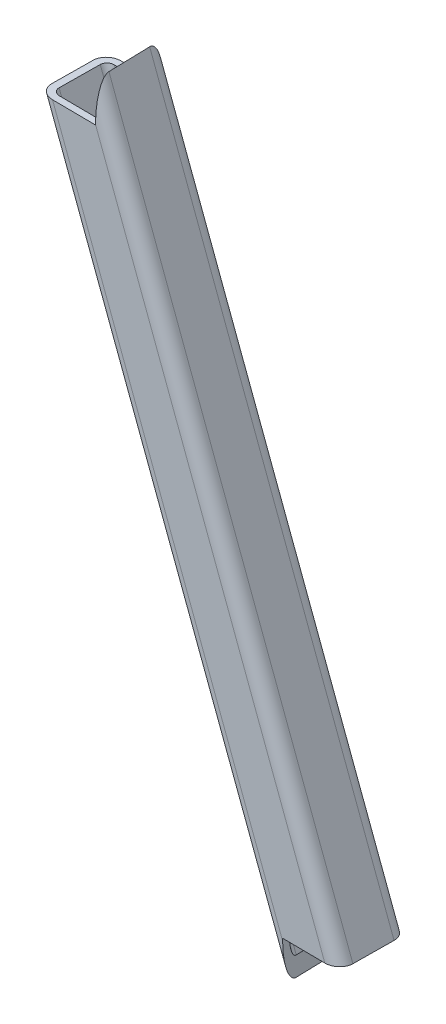
ISO-10303-21;
HEADER;
FILE_DESCRIPTION(('STEP AP214'),'2;1');
FILE_NAME('part.step','',(''),(''),'','','');
FILE_SCHEMA(('AUTOMOTIVE_DESIGN { 1 0 10303 214 1 1 1 1 }'));
ENDSEC;
DATA;
#1=APPLICATION_CONTEXT('core data for automotive mechanical design processes');
#2=APPLICATION_PROTOCOL_DEFINITION('international standard','automotive_design',2000,#1);
#3=PRODUCT_CONTEXT('',#1,'mechanical');
#4=PRODUCT('Part','Part','',(#3));
#5=PRODUCT_RELATED_PRODUCT_CATEGORY('part','',(#4));
#6=PRODUCT_DEFINITION_FORMATION('','',#4);
#7=PRODUCT_DEFINITION_CONTEXT('part definition',#1,'design');
#8=PRODUCT_DEFINITION('design','',#6,#7);
#9=PRODUCT_DEFINITION_SHAPE('','',#8);
#10=(LENGTH_UNIT() NAMED_UNIT(*) SI_UNIT(.MILLI.,.METRE.));
#11=(NAMED_UNIT(*) PLANE_ANGLE_UNIT() SI_UNIT($,.RADIAN.));
#12=(NAMED_UNIT(*) SI_UNIT($,.STERADIAN.) SOLID_ANGLE_UNIT());
#13=UNCERTAINTY_MEASURE_WITH_UNIT(LENGTH_MEASURE(1.E-05),#10,'distance_accuracy_value','');
#14=(GEOMETRIC_REPRESENTATION_CONTEXT(3) GLOBAL_UNCERTAINTY_ASSIGNED_CONTEXT((#13)) GLOBAL_UNIT_ASSIGNED_CONTEXT((#10,
#11,#12)) REPRESENTATION_CONTEXT('',''));
#15=CARTESIAN_POINT('',(0.,0.,0.));
#16=DIRECTION('',(0.,0.,1.));
#17=DIRECTION('',(1.,0.,0.));
#18=AXIS2_PLACEMENT_3D('',#15,#16,#17);
#19=CARTESIAN_POINT('',(-215.582628574558,203.531514284541,-455.902670776298));
#20=DIRECTION('',(-0.936285084522112,-0.351106906695792,-0.00970466753341229));
#21=DIRECTION('',(0.351123441588391,-0.936329177569045,0.));
#22=AXIS2_PLACEMENT_3D('',#19,#20,#21);
#23=PLANE('',#22);
#24=DIRECTION('',(0.,0.0276296546157097,-0.999618228218062));
#25=VECTOR('',#24,1.);
#26=CARTESIAN_POINT('',(-215.,201.979024158734,-455.945581924533));
#27=LINE('',#26,#25);
#28=CARTESIAN_POINT('',(-215.,201.646171222709,-443.903235873035));
#29=VERTEX_POINT('',#28);
#30=CARTESIAN_POINT('',(-215.,201.97783808572,-455.902670776298));
#31=VERTEX_POINT('',#30);
#32=EDGE_CURVE('E217',#29,#31,#27,.T.);
#33=ORIENTED_EDGE('',*,*,#32,.F.);
#34=DIRECTION('',(0.351123441588391,-0.936329177569045,0.));
#35=VECTOR('',#34,1.);
#36=CARTESIAN_POINT('',(-215.691669734999,203.490623849375,-443.903235873035));
#37=LINE('',#36,#35);
#38=CARTESIAN_POINT('',(-143.132685791484,10.,-443.903235873033));
#39=VERTEX_POINT('',#38);
#40=EDGE_CURVE('E45',#29,#39,#37,.T.);
#41=ORIENTED_EDGE('',*,*,#40,.T.);
#42=DIRECTION('',(-0.0103645208346966,0.,0.999946286911386));
#43=VECTOR('',#42,1.);
#44=CARTESIAN_POINT('',(-143.016106890004,10.,-455.150513149687));
#45=LINE('',#44,#43);
#46=CARTESIAN_POINT('',(-143.008310717855,10.,-455.902670776297));
#47=VERTEX_POINT('',#46);
#48=EDGE_CURVE('E215',#47,#39,#45,.T.);
#49=ORIENTED_EDGE('',*,*,#48,.F.);
#50=DIRECTION('',(0.351123441588391,-0.936329177569045,0.));
#51=VECTOR('',#50,1.);
#52=CARTESIAN_POINT('',(-215.582628574558,203.531514284541,-455.902670776298));
#53=LINE('',#52,#51);
#54=EDGE_CURVE('E313',#31,#47,#53,.T.);
#55=ORIENTED_EDGE('',*,*,#54,.F.);
#56=EDGE_LOOP('',(#33,#41,#49,#55));
#57=FACE_BOUND('',#56,.T.);
#58=ADVANCED_FACE('F41',(#57),#23,.F.);
#59=CARTESIAN_POINT('',(-219.436810073088,202.086196222592,-443.942054543168));
#60=DIRECTION('',(0.351123441588391,-0.936329177569045,0.));
#61=DIRECTION('',(0.936329177569045,0.351123441588391,0.));
#62=AXIS2_PLACEMENT_3D('',#59,#60,#61);
#63=CYLINDRICAL_SURFACE('',#62,3.99999999999994);
#64=CARTESIAN_POINT('',(-215.,190.254702694357,-443.942054543168));
#65=DIRECTION('',(-1.,0.,0.));
#66=DIRECTION('',(0.,-1.,0.));
#67=AXIS2_PLACEMENT_3D('',#64,#65,#66);
#68=ELLIPSE('',#67,11.3920049937566,3.99999999999994);
#69=CARTESIAN_POINT('',(-215.,190.144147073355,-439.942242908747));
#70=VERTEX_POINT('',#69);
#71=EDGE_CURVE('E220',#70,#29,#68,.T.);
#72=ORIENTED_EDGE('',*,*,#71,.F.);
#73=DIRECTION('',(0.351123441588391,-0.936329177569045,0.));
#74=VECTOR('',#73,1.);
#75=CARTESIAN_POINT('',(-219.473157126568,202.072566077537,-439.942242908747));
#76=LINE('',#75,#74);
#77=CARTESIAN_POINT('',(-147.445944847492,10.,-439.942242908747));
#78=VERTEX_POINT('',#77);
#79=EDGE_CURVE('E201',#70,#78,#76,.T.);
#80=ORIENTED_EDGE('',*,*,#79,.T.);
#81=CARTESIAN_POINT('',(-147.404486489616,10.,-443.942054543168));
#82=DIRECTION('',(0.,-1.,0.));
#83=DIRECTION('',(1.,0.,0.));
#84=AXIS2_PLACEMENT_3D('',#81,#82,#83);
#85=ELLIPSE('',#84,4.2720018726587,3.99999999999994);
#86=EDGE_CURVE('E221',#39,#78,#85,.T.);
#87=ORIENTED_EDGE('',*,*,#86,.F.);
#88=ORIENTED_EDGE('',*,*,#40,.F.);
#89=EDGE_LOOP('',(#72,#80,#87,#88));
#90=FACE_BOUND('',#89,.T.);
#91=ADVANCED_FACE('F218',(#90),#63,.T.);
#92=CARTESIAN_POINT('',(-230.708578140834,197.859283197187,-440.058698919148));
#93=DIRECTION('',(0.00908676337012152,0.00340753626379529,-0.999952908605233));
#94=DIRECTION('',(-0.999958714034088,0.,-0.0090868161251641));
#95=AXIS2_PLACEMENT_3D('',#92,#93,#94);
#96=PLANE('',#95);
#97=DIRECTION('',(0.999958714034088,0.,0.0090868161251641));
#98=VECTOR('',#97,1.);
#99=CARTESIAN_POINT('',(-230.708334787284,190.,-440.085478761454));
#100=LINE('',#99,#98);
#101=CARTESIAN_POINT('',(-227.761346941915,190.,-440.058698919148));
#102=VERTEX_POINT('',#101);
#103=CARTESIAN_POINT('',(-215.,190.,-439.942734118259));
#104=VERTEX_POINT('',#103);
#105=EDGE_CURVE('E151',#102,#104,#100,.T.);
#106=ORIENTED_EDGE('',*,*,#105,.F.);
#107=DIRECTION('',(0.351123441588391,-0.936329177569045,0.));
#108=VECTOR('',#107,1.);
#109=CARTESIAN_POINT('',(-230.708578140834,197.859283197187,-440.058698919148));
#110=LINE('',#109,#108);
#111=CARTESIAN_POINT('',(-159.999999999999,9.30307482153431,-440.058698919148));
#112=VERTEX_POINT('',#111);
#113=EDGE_CURVE('E197',#102,#112,#110,.T.);
#114=ORIENTED_EDGE('',*,*,#113,.T.);
#115=DIRECTION('',(0.,-0.999994193852042,-0.00340767695139612));
#116=VECTOR('',#115,1.);
#117=CARTESIAN_POINT('',(-159.999999999999,197.857093633055,-439.416164004498));
#118=LINE('',#117,#116);
#119=CARTESIAN_POINT('',(-159.999999999999,10.,-440.056324009492));
#120=VERTEX_POINT('',#119);
#121=EDGE_CURVE('E180',#120,#112,#118,.T.);
#122=ORIENTED_EDGE('',*,*,#121,.F.);
#123=DIRECTION('',(-0.999958714034088,0.,-0.0090868161251641));
#124=VECTOR('',#123,1.);
#125=CARTESIAN_POINT('',(-230.702761296941,10.,-440.698813526739));
#126=LINE('',#125,#124);
#127=EDGE_CURVE('E307',#78,#120,#126,.T.);
#128=ORIENTED_EDGE('',*,*,#127,.F.);
#129=ORIENTED_EDGE('',*,*,#79,.F.);
#130=DIRECTION('',(0.,0.999994193852042,0.00340767695139612));
#131=VECTOR('',#130,1.);
#132=CARTESIAN_POINT('',(-215.,197.858796764845,-439.915953722167));
#133=LINE('',#132,#131);
#134=EDGE_CURVE('E244',#104,#70,#133,.T.);
#135=ORIENTED_EDGE('',*,*,#134,.F.);
#136=EDGE_LOOP('',(#106,#114,#122,#128,#129,#135));
#137=FACE_BOUND('',#136,.T.);
#138=ADVANCED_FACE('F401',(#137),#96,.F.);
#139=CARTESIAN_POINT('',(-230.672231087354,197.872913342242,-444.058510553569));
#140=DIRECTION('',(0.351123441588391,-0.936329177569045,0.));
#141=DIRECTION('',(0.936329177569045,0.351123441588391,0.));
#142=AXIS2_PLACEMENT_3D('',#139,#140,#141);
#143=CYLINDRICAL_SURFACE('',#142,3.99999999999996);
#144=CARTESIAN_POINT('',(-227.719888584013,190.,-444.058510553569));
#145=DIRECTION('',(0.,1.,0.));
#146=DIRECTION('',(1.,0.,0.));
#147=AXIS2_PLACEMENT_3D('',#144,#145,#146);
#148=ELLIPSE('',#147,4.27200187265872,3.99999999999996);
#149=CARTESIAN_POINT('',(-231.991689282145,190.,-444.097329223703));
#150=VERTEX_POINT('',#149);
#151=EDGE_CURVE('E160',#150,#102,#148,.T.);
#152=ORIENTED_EDGE('',*,*,#151,.F.);
#153=DIRECTION('',(0.351123441588391,-0.936329177569045,0.));
#154=VECTOR('',#153,1.);
#155=CARTESIAN_POINT('',(-234.417371425442,196.468485715459,-444.097329223703));
#156=LINE('',#155,#154);
#157=CARTESIAN_POINT('',(-159.999999999999,-1.97783808572122,-444.097329223703));
#158=VERTEX_POINT('',#157);
#159=EDGE_CURVE('E191',#150,#158,#156,.T.);
#160=ORIENTED_EDGE('',*,*,#159,.T.);
#161=CARTESIAN_POINT('',(-159.999999999999,9.41363044263024,-444.058510553569));
#162=DIRECTION('',(1.,0.,0.));
#163=DIRECTION('',(0.,-1.,0.));
#164=AXIS2_PLACEMENT_3D('',#161,#162,#163);
#165=ELLIPSE('',#164,11.3920049937566,3.99999999999996);
#166=EDGE_CURVE('E174',#112,#158,#165,.T.);
#167=ORIENTED_EDGE('',*,*,#166,.F.);
#168=ORIENTED_EDGE('',*,*,#113,.F.);
#169=EDGE_LOOP('',(#152,#160,#167,#168));
#170=FACE_BOUND('',#169,.T.);
#171=ADVANCED_FACE('F196',(#170),#143,.T.);
#172=CARTESIAN_POINT('',(-234.417371425442,196.468485715459,-444.097329223703));
#173=DIRECTION('',(0.936285084522112,0.351106906695792,0.00970466753341229));
#174=DIRECTION('',(-0.351123441588391,0.936329177569045,0.));
#175=AXIS2_PLACEMENT_3D('',#172,#173,#174);
#176=PLANE('',#175);
#177=DIRECTION('',(-0.0103645208346966,0.,0.999946286911386));
#178=VECTOR('',#177,1.);
#179=CARTESIAN_POINT('',(-231.991949856906,190.,-444.072189540993));
#180=LINE('',#179,#178);
#181=CARTESIAN_POINT('',(-231.867314208516,190.,-456.096764126966));
#182=VERTEX_POINT('',#181);
#183=EDGE_CURVE('E232',#182,#150,#180,.T.);
#184=ORIENTED_EDGE('',*,*,#183,.F.);
#185=DIRECTION('',(0.351123441588391,-0.936329177569045,0.));
#186=VECTOR('',#185,1.);
#187=CARTESIAN_POINT('',(-234.308330265,196.509376150625,-456.096764126965));
#188=LINE('',#187,#186);
#189=CARTESIAN_POINT('',(-159.999999999999,-1.64617122271102,-456.096764126966));
#190=VERTEX_POINT('',#189);
#191=EDGE_CURVE('E193',#182,#190,#188,.T.);
#192=ORIENTED_EDGE('',*,*,#191,.T.);
#193=DIRECTION('',(0.,0.0276296546157106,-0.999618228218062));
#194=VECTOR('',#193,1.);
#195=CARTESIAN_POINT('',(-159.999999999999,-1.82634459589862,-449.578239354114));
#196=LINE('',#195,#194);
#197=EDGE_CURVE('E177',#158,#190,#196,.T.);
#198=ORIENTED_EDGE('',*,*,#197,.F.);
#199=ORIENTED_EDGE('',*,*,#159,.F.);
#200=EDGE_LOOP('',(#184,#192,#198,#199));
#201=FACE_BOUND('',#200,.T.);
#202=ADVANCED_FACE('F190',(#201),#176,.F.);
#203=CARTESIAN_POINT('',(-230.563189926911,197.913803777408,-456.057945456832));
#204=DIRECTION('',(0.351123441588391,-0.936329177569045,0.));
#205=DIRECTION('',(0.936329177569045,0.351123441588391,0.));
#206=AXIS2_PLACEMENT_3D('',#203,#204,#205);
#207=CYLINDRICAL_SURFACE('',#206,3.99999999999994);
#208=CARTESIAN_POINT('',(-227.595513510383,190.,-456.057945456832));
#209=DIRECTION('',(0.,1.,0.));
#210=DIRECTION('',(1.,0.,0.));
#211=AXIS2_PLACEMENT_3D('',#208,#209,#210);
#212=ELLIPSE('',#211,4.2720018726587,3.99999999999994);
#213=CARTESIAN_POINT('',(-227.554055152508,190.,-460.057757091253));
#214=VERTEX_POINT('',#213);
#215=EDGE_CURVE('E230',#214,#182,#212,.T.);
#216=ORIENTED_EDGE('',*,*,#215,.F.);
#217=DIRECTION('',(0.351123441588391,-0.936329177569045,0.));
#218=VECTOR('',#217,1.);
#219=CARTESIAN_POINT('',(-230.526842873431,197.927433922463,-460.057757091253));
#220=LINE('',#219,#218);
#221=CARTESIAN_POINT('',(-159.999999999999,9.85585292664354,-460.057757091253));
#222=VERTEX_POINT('',#221);
#223=EDGE_CURVE('E199',#214,#222,#220,.T.);
#224=ORIENTED_EDGE('',*,*,#223,.T.);
#225=CARTESIAN_POINT('',(-159.999999999999,9.74529730564203,-456.057945456832));
#226=DIRECTION('',(1.,0.,0.));
#227=DIRECTION('',(0.,-1.,0.));
#228=AXIS2_PLACEMENT_3D('',#225,#226,#227);
#229=ELLIPSE('',#228,11.3920049937566,3.99999999999994);
#230=EDGE_CURVE('E194',#190,#222,#229,.T.);
#231=ORIENTED_EDGE('',*,*,#230,.F.);
#232=ORIENTED_EDGE('',*,*,#191,.F.);
#233=EDGE_LOOP('',(#216,#224,#231,#232));
#234=FACE_BOUND('',#233,.T.);
#235=ADVANCED_FACE('F240',(#234),#207,.T.);
#236=CARTESIAN_POINT('',(-219.291421859166,202.140716802813,-459.941301080852));
#237=DIRECTION('',(-0.00908676337012152,-0.00340753626379529,0.999952908605233));
#238=DIRECTION('',(0.999958714034088,0.,0.0090868161251641));
#239=AXIS2_PLACEMENT_3D('',#236,#237,#238);
#240=PLANE('',#239);
#241=DIRECTION('',(-0.999958714034088,0.,-0.0090868161251641));
#242=VECTOR('',#241,1.);
#243=CARTESIAN_POINT('',(-219.291045936011,190.,-459.9826695458));
#244=LINE('',#243,#242);
#245=CARTESIAN_POINT('',(-215.,190.,-459.943675990508));
#246=VERTEX_POINT('',#245);
#247=EDGE_CURVE('E234',#246,#214,#244,.T.);
#248=ORIENTED_EDGE('',*,*,#247,.F.);
#249=DIRECTION('',(0.,-0.999994193852042,-0.00340767695139612));
#250=VECTOR('',#249,1.);
#251=CARTESIAN_POINT('',(-215.,202.140583914504,-459.902304562318));
#252=LINE('',#251,#250);
#253=CARTESIAN_POINT('',(-215.,190.696925178369,-459.941301080852));
#254=VERTEX_POINT('',#253);
#255=EDGE_CURVE('E284',#254,#246,#252,.T.);
#256=ORIENTED_EDGE('',*,*,#255,.F.);
#257=DIRECTION('',(0.351123441588391,-0.936329177569045,0.));
#258=VECTOR('',#257,1.);
#259=CARTESIAN_POINT('',(-219.291421859166,202.140716802813,-459.941301080852));
#260=LINE('',#259,#258);
#261=CARTESIAN_POINT('',(-147.238653058112,10.,-459.941301080852));
#262=VERTEX_POINT('',#261);
#263=EDGE_CURVE('E336',#254,#262,#260,.T.);
#264=ORIENTED_EDGE('',*,*,#263,.T.);
#265=DIRECTION('',(0.999958714034088,0.,0.0090868161251641));
#266=VECTOR('',#265,1.);
#267=CARTESIAN_POINT('',(-219.285472445669,10.,-460.596004311085));
#268=LINE('',#267,#266);
#269=CARTESIAN_POINT('',(-159.999999999999,10.,-460.057265881741));
#270=VERTEX_POINT('',#269);
#271=EDGE_CURVE('E301',#270,#262,#268,.T.);
#272=ORIENTED_EDGE('',*,*,#271,.F.);
#273=DIRECTION('',(0.,0.999994193852042,0.00340767695139612));
#274=VECTOR('',#273,1.);
#275=CARTESIAN_POINT('',(-159.999999999999,202.138880782714,-459.402514844649));
#276=LINE('',#275,#274);
#277=EDGE_CURVE('E248',#222,#270,#276,.T.);
#278=ORIENTED_EDGE('',*,*,#277,.F.);
#279=ORIENTED_EDGE('',*,*,#223,.F.);
#280=EDGE_LOOP('',(#248,#256,#264,#272,#278,#279));
#281=FACE_BOUND('',#280,.T.);
#282=ADVANCED_FACE('F342',(#281),#240,.F.);
#283=CARTESIAN_POINT('',(-219.327768912646,202.127086657757,-455.941489446431));
#284=DIRECTION('',(0.351123441588391,-0.936329177569045,0.));
#285=DIRECTION('',(0.936329177569045,0.351123441588391,0.));
#286=AXIS2_PLACEMENT_3D('',#283,#284,#285);
#287=CYLINDRICAL_SURFACE('',#286,3.99999999999996);
#288=CARTESIAN_POINT('',(-215.,190.586369557368,-455.941489446431));
#289=DIRECTION('',(-1.,0.,0.));
#290=DIRECTION('',(0.,-1.,0.));
#291=AXIS2_PLACEMENT_3D('',#288,#289,#290);
#292=ELLIPSE('',#291,11.3920049937566,3.99999999999996);
#293=EDGE_CURVE('E286',#31,#254,#292,.T.);
#294=ORIENTED_EDGE('',*,*,#293,.F.);
#295=ORIENTED_EDGE('',*,*,#54,.T.);
#296=CARTESIAN_POINT('',(-147.280111415987,10.,-455.941489446431));
#297=DIRECTION('',(0.,-1.,0.));
#298=DIRECTION('',(1.,0.,0.));
#299=AXIS2_PLACEMENT_3D('',#296,#297,#298);
#300=ELLIPSE('',#299,4.27200187265872,3.99999999999996);
#301=EDGE_CURVE('E303',#262,#47,#300,.T.);
#302=ORIENTED_EDGE('',*,*,#301,.F.);
#303=ORIENTED_EDGE('',*,*,#263,.F.);
#304=EDGE_LOOP('',(#294,#295,#302,#303));
#305=FACE_BOUND('',#304,.T.);
#306=ADVANCED_FACE('F346',(#305),#287,.T.);
#307=CARTESIAN_POINT('',(-143.999999999999,10.,-200.));
#308=DIRECTION('',(0.,-1.,0.));
#309=DIRECTION('',(0.,0.,-1.));
#310=AXIS2_PLACEMENT_3D('',#307,#308,#309);
#311=PLANE('',#310);
#312=DIRECTION('',(0.,0.,-1.));
#313=VECTOR('',#312,1.);
#314=CARTESIAN_POINT('',(-159.999999999999,10.,-200.));
#315=LINE('',#314,#313);
#316=CARTESIAN_POINT('',(-159.999999999999,10.,-458.057171694516));
#317=VERTEX_POINT('',#316);
#318=EDGE_CURVE('E304',#317,#270,#315,.T.);
#319=ORIENTED_EDGE('',*,*,#318,.T.);
#320=ORIENTED_EDGE('',*,*,#271,.T.);
#321=ORIENTED_EDGE('',*,*,#301,.T.);
#322=ORIENTED_EDGE('',*,*,#48,.T.);
#323=ORIENTED_EDGE('',*,*,#86,.T.);
#324=ORIENTED_EDGE('',*,*,#127,.T.);
#325=CARTESIAN_POINT('',(-159.999999999999,10.,-442.056418196717));
#326=VERTEX_POINT('',#325);
#327=EDGE_CURVE('E310',#120,#326,#315,.T.);
#328=ORIENTED_EDGE('',*,*,#327,.T.);
#329=DIRECTION('',(-0.999958714034088,0.,-0.0090868161251641));
#330=VECTOR('',#329,1.);
#331=CARTESIAN_POINT('',(-230.684587559181,10.,-442.698742565732));
#332=LINE('',#331,#330);
#333=CARTESIAN_POINT('',(-147.425215668353,10.,-441.942148725956));
#334=VERTEX_POINT('',#333);
#335=EDGE_CURVE('E259',#334,#326,#332,.T.);
#336=ORIENTED_EDGE('',*,*,#335,.F.);
#337=CARTESIAN_POINT('',(-147.404486489616,10.,-443.942054543168));
#338=DIRECTION('',(0.,-1.,0.));
#339=DIRECTION('',(1.,0.,0.));
#340=AXIS2_PLACEMENT_3D('',#337,#338,#339);
#341=ELLIPSE('',#340,2.13600093632946,2.00000000000008);
#342=CARTESIAN_POINT('',(-145.26858614055,10.,-443.922645208102));
#343=VERTEX_POINT('',#342);
#344=EDGE_CURVE('E276',#343,#334,#341,.T.);
#345=ORIENTED_EDGE('',*,*,#344,.F.);
#346=DIRECTION('',(-0.0103645208346571,0.,0.999946286911386));
#347=VECTOR('',#346,1.);
#348=CARTESIAN_POINT('',(-145.151978951275,10.,-455.172651629296));
#349=LINE('',#348,#347);
#350=CARTESIAN_POINT('',(-145.144211066922,10.,-455.922080111365));
#351=VERTEX_POINT('',#350);
#352=EDGE_CURVE('E271',#351,#343,#349,.T.);
#353=ORIENTED_EDGE('',*,*,#352,.F.);
#354=CARTESIAN_POINT('',(-147.280111415987,10.,-455.941489446431));
#355=DIRECTION('',(0.,-1.,0.));
#356=DIRECTION('',(1.,0.,0.));
#357=AXIS2_PLACEMENT_3D('',#354,#355,#356);
#358=ELLIPSE('',#357,2.13600093632924,1.99999999999987);
#359=CARTESIAN_POINT('',(-147.259382237049,10.,-457.941395263642));
#360=VERTEX_POINT('',#359);
#361=EDGE_CURVE('E266',#360,#351,#358,.T.);
#362=ORIENTED_EDGE('',*,*,#361,.F.);
#363=DIRECTION('',(0.999958714034088,0.,0.0090868161251641));
#364=VECTOR('',#363,1.);
#365=CARTESIAN_POINT('',(-219.30364618343,10.,-458.596075272092));
#366=LINE('',#365,#364);
#367=EDGE_CURVE('E254',#317,#360,#366,.T.);
#368=ORIENTED_EDGE('',*,*,#367,.F.);
#369=EDGE_LOOP('',(#319,#320,#321,#322,#323,#324,#328,#336,#345,#353,#362,#368));
#370=FACE_BOUND('',#369,.T.);
#371=ADVANCED_FACE('F348',(#370),#311,.T.);
#372=CARTESIAN_POINT('',(-159.999999999999,-6.00000000000001,-200.));
#373=DIRECTION('',(1.,0.,0.));
#374=DIRECTION('',(0.,0.,-1.));
#375=AXIS2_PLACEMENT_3D('',#372,#373,#374);
#376=PLANE('',#375);
#377=ORIENTED_EDGE('',*,*,#277,.T.);
#378=ORIENTED_EDGE('',*,*,#318,.F.);
#379=DIRECTION('',(0.,0.999994193852042,0.00340767695139612));
#380=VECTOR('',#379,1.);
#381=CARTESIAN_POINT('',(-159.999999999999,202.132065147424,-457.402443883043));
#382=LINE('',#381,#380);
#383=CARTESIAN_POINT('',(-159.999999999999,9.80057511614285,-458.057851274042));
#384=VERTEX_POINT('',#383);
#385=EDGE_CURVE('E252',#384,#317,#382,.T.);
#386=ORIENTED_EDGE('',*,*,#385,.F.);
#387=CARTESIAN_POINT('',(-159.999999999999,9.74529730564203,-456.057945456832));
#388=DIRECTION('',(1.,0.,0.));
#389=DIRECTION('',(0.,-1.,0.));
#390=AXIS2_PLACEMENT_3D('',#387,#388,#389);
#391=ELLIPSE('',#390,5.69600249687858,2.00000000000008);
#392=CARTESIAN_POINT('',(-159.999999999999,4.04956304146465,-456.077354791899));
#393=VERTEX_POINT('',#392);
#394=EDGE_CURVE('E11',#393,#384,#391,.T.);
#395=ORIENTED_EDGE('',*,*,#394,.F.);
#396=DIRECTION('',(0.,0.0276296546156054,-0.999618228218064));
#397=VECTOR('',#396,1.);
#398=CARTESIAN_POINT('',(-159.999999999999,3.86557762567999,-449.420913446419));
#399=LINE('',#398,#397);
#400=CARTESIAN_POINT('',(-159.999999999999,3.71789617845571,-444.077919888634));
#401=VERTEX_POINT('',#400);
#402=EDGE_CURVE('E333',#401,#393,#399,.T.);
#403=ORIENTED_EDGE('',*,*,#402,.F.);
#404=CARTESIAN_POINT('',(-159.999999999999,9.41363044263024,-444.058510553569));
#405=DIRECTION('',(1.,0.,0.));
#406=DIRECTION('',(0.,-1.,0.));
#407=AXIS2_PLACEMENT_3D('',#404,#405,#406);
#408=ELLIPSE('',#407,5.69600249687798,1.99999999999987);
#409=CARTESIAN_POINT('',(-159.999999999999,9.35835263212953,-442.058604736359));
#410=VERTEX_POINT('',#409);
#411=EDGE_CURVE('E118',#410,#401,#408,.T.);
#412=ORIENTED_EDGE('',*,*,#411,.F.);
#413=DIRECTION('',(0.,-0.999994193852042,-0.00340767695139612));
#414=VECTOR('',#413,1.);
#415=CARTESIAN_POINT('',(-159.999999999999,197.863909268345,-441.416234966105));
#416=LINE('',#415,#414);
#417=EDGE_CURVE('E109',#326,#410,#416,.T.);
#418=ORIENTED_EDGE('',*,*,#417,.F.);
#419=ORIENTED_EDGE('',*,*,#327,.F.);
#420=ORIENTED_EDGE('',*,*,#121,.T.);
#421=ORIENTED_EDGE('',*,*,#166,.T.);
#422=ORIENTED_EDGE('',*,*,#197,.T.);
#423=ORIENTED_EDGE('',*,*,#230,.T.);
#424=EDGE_LOOP('',(#377,#378,#386,#395,#403,#412,#418,#419,#420,#421,#422,#423));
#425=FACE_BOUND('',#424,.T.);
#426=ADVANCED_FACE('F176',(#425),#376,.T.);
#427=CARTESIAN_POINT('',(-215.,194.,-450.));
#428=DIRECTION('',(-1.,0.,0.));
#429=DIRECTION('',(0.,0.,1.));
#430=AXIS2_PLACEMENT_3D('',#427,#428,#429);
#431=PLANE('',#430);
#432=CARTESIAN_POINT('',(-215.,190.586369557368,-455.941489446431));
#433=DIRECTION('',(-1.,0.,0.));
#434=DIRECTION('',(0.,-1.,0.));
#435=AXIS2_PLACEMENT_3D('',#432,#433,#434);
#436=ELLIPSE('',#435,5.69600249687798,1.99999999999987);
#437=CARTESIAN_POINT('',(-215.,196.282103821542,-455.922080111365));
#438=VERTEX_POINT('',#437);
#439=CARTESIAN_POINT('',(-215.,190.641647367869,-457.941395263642));
#440=VERTEX_POINT('',#439);
#441=EDGE_CURVE('E267',#438,#440,#436,.T.);
#442=ORIENTED_EDGE('',*,*,#441,.F.);
#443=DIRECTION('',(0.,0.0276296546156045,-0.999618228218064));
#444=VECTOR('',#443,1.);
#445=CARTESIAN_POINT('',(-215.,196.287101937154,-456.102907832207));
#446=LINE('',#445,#444);
#447=CARTESIAN_POINT('',(-215.,195.950436958534,-443.922645208102));
#448=VERTEX_POINT('',#447);
#449=EDGE_CURVE('E272',#448,#438,#446,.T.);
#450=ORIENTED_EDGE('',*,*,#449,.F.);
#451=CARTESIAN_POINT('',(-215.,190.254702694357,-443.942054543168));
#452=DIRECTION('',(-1.,0.,0.));
#453=DIRECTION('',(0.,-1.,0.));
#454=AXIS2_PLACEMENT_3D('',#451,#452,#453);
#455=ELLIPSE('',#454,5.69600249687858,2.00000000000008);
#456=CARTESIAN_POINT('',(-215.,190.199424884411,-441.942148725956));
#457=VERTEX_POINT('',#456);
#458=EDGE_CURVE('E258',#457,#448,#455,.T.);
#459=ORIENTED_EDGE('',*,*,#458,.F.);
#460=DIRECTION('',(0.,0.999994193852042,0.00340767695139612));
#461=VECTOR('',#460,1.);
#462=CARTESIAN_POINT('',(-215.,197.865612400135,-441.916024683774));
#463=LINE('',#462,#461);
#464=CARTESIAN_POINT('',(-215.,190.,-441.942828305484));
#465=VERTEX_POINT('',#464);
#466=EDGE_CURVE('E280',#465,#457,#463,.T.);
#467=ORIENTED_EDGE('',*,*,#466,.F.);
#468=DIRECTION('',(0.,0.,1.));
#469=VECTOR('',#468,1.);
#470=CARTESIAN_POINT('',(-215.,190.,-450.));
#471=LINE('',#470,#469);
#472=EDGE_CURVE('E242',#465,#104,#471,.T.);
#473=ORIENTED_EDGE('',*,*,#472,.T.);
#474=ORIENTED_EDGE('',*,*,#134,.T.);
#475=ORIENTED_EDGE('',*,*,#71,.T.);
#476=ORIENTED_EDGE('',*,*,#32,.T.);
#477=ORIENTED_EDGE('',*,*,#293,.T.);
#478=ORIENTED_EDGE('',*,*,#255,.T.);
#479=CARTESIAN_POINT('',(-215.,190.,-457.943581803283));
#480=VERTEX_POINT('',#479);
#481=EDGE_CURVE('E246',#246,#480,#471,.T.);
#482=ORIENTED_EDGE('',*,*,#481,.T.);
#483=DIRECTION('',(0.,-0.999994193852042,-0.00340767695139612));
#484=VECTOR('',#483,1.);
#485=CARTESIAN_POINT('',(-215.,202.133768279214,-457.902233600711));
#486=LINE('',#485,#484);
#487=EDGE_CURVE('E263',#440,#480,#486,.T.);
#488=ORIENTED_EDGE('',*,*,#487,.F.);
#489=EDGE_LOOP('',(#442,#450,#459,#467,#473,#474,#475,#476,#477,#478,#482,#488));
#490=FACE_BOUND('',#489,.T.);
#491=ADVANCED_FACE('F404',(#490),#431,.T.);
#492=CARTESIAN_POINT('',(-219.,190.,-450.));
#493=DIRECTION('',(0.,1.,0.));
#494=DIRECTION('',(0.,0.,1.));
#495=AXIS2_PLACEMENT_3D('',#492,#493,#494);
#496=PLANE('',#495);
#497=ORIENTED_EDGE('',*,*,#247,.T.);
#498=ORIENTED_EDGE('',*,*,#215,.T.);
#499=ORIENTED_EDGE('',*,*,#183,.T.);
#500=ORIENTED_EDGE('',*,*,#151,.T.);
#501=ORIENTED_EDGE('',*,*,#105,.T.);
#502=ORIENTED_EDGE('',*,*,#472,.F.);
#503=DIRECTION('',(0.999958714034088,0.,0.0090868161251641));
#504=VECTOR('',#503,1.);
#505=CARTESIAN_POINT('',(-230.690161049523,190.,-442.085407800447));
#506=LINE('',#505,#504);
#507=CARTESIAN_POINT('',(-227.740617762951,190.,-442.058604736359));
#508=VERTEX_POINT('',#507);
#509=EDGE_CURVE('E261',#508,#465,#506,.T.);
#510=ORIENTED_EDGE('',*,*,#509,.F.);
#511=CARTESIAN_POINT('',(-227.719888584013,190.,-444.058510553569));
#512=DIRECTION('',(0.,1.,0.));
#513=DIRECTION('',(1.,0.,0.));
#514=AXIS2_PLACEMENT_3D('',#511,#512,#513);
#515=ELLIPSE('',#514,2.13600093632924,1.99999999999987);
#516=CARTESIAN_POINT('',(-229.855788933078,190.,-444.077919888636));
#517=VERTEX_POINT('',#516);
#518=EDGE_CURVE('E329',#517,#508,#515,.T.);
#519=ORIENTED_EDGE('',*,*,#518,.F.);
#520=DIRECTION('',(-0.0103645208346571,0.,0.999946286911386));
#521=VECTOR('',#520,1.);
#522=CARTESIAN_POINT('',(-229.856077795635,190.,-444.050051061387));
#523=LINE('',#522,#521);
#524=CARTESIAN_POINT('',(-229.73141385945,190.,-456.077354791899));
#525=VERTEX_POINT('',#524);
#526=EDGE_CURVE('E334',#525,#517,#523,.T.);
#527=ORIENTED_EDGE('',*,*,#526,.F.);
#528=CARTESIAN_POINT('',(-227.595513510383,190.,-456.057945456832));
#529=DIRECTION('',(0.,1.,0.));
#530=DIRECTION('',(1.,0.,0.));
#531=AXIS2_PLACEMENT_3D('',#528,#529,#530);
#532=ELLIPSE('',#531,2.13600093632946,2.00000000000008);
#533=CARTESIAN_POINT('',(-227.574784331446,190.,-458.057851274042));
#534=VERTEX_POINT('',#533);
#535=EDGE_CURVE('E292',#534,#525,#532,.T.);
#536=ORIENTED_EDGE('',*,*,#535,.F.);
#537=DIRECTION('',(-0.999958714034088,0.,-0.0090868161251641));
#538=VECTOR('',#537,1.);
#539=CARTESIAN_POINT('',(-219.309219673772,190.,-457.982740506807));
#540=LINE('',#539,#538);
#541=EDGE_CURVE('E60',#480,#534,#540,.T.);
#542=ORIENTED_EDGE('',*,*,#541,.F.);
#543=ORIENTED_EDGE('',*,*,#481,.F.);
#544=EDGE_LOOP('',(#497,#498,#499,#500,#501,#502,#510,#519,#527,#536,#542,#543));
#545=FACE_BOUND('',#544,.T.);
#546=ADVANCED_FACE('F231',(#545),#496,.T.);
#547=CARTESIAN_POINT('',(-232.544801256397,197.170699528851,-444.077919888636));
#548=DIRECTION('',(0.936285084522112,0.351106906695792,0.00970466753337531));
#549=DIRECTION('',(-0.351123441588391,0.936329177569045,0.));
#550=AXIS2_PLACEMENT_3D('',#547,#548,#549);
#551=PLANE('',#550);
#552=DIRECTION('',(0.351123441588391,-0.936329177569045,0.));
#553=VECTOR('',#552,1.);
#554=CARTESIAN_POINT('',(-232.435760095956,197.211589964016,-456.077354791899));
#555=LINE('',#554,#553);
#556=EDGE_CURVE('E51',#525,#393,#555,.T.);
#557=ORIENTED_EDGE('',*,*,#556,.F.);
#558=ORIENTED_EDGE('',*,*,#526,.T.);
#559=DIRECTION('',(0.351123441588391,-0.936329177569045,0.));
#560=VECTOR('',#559,1.);
#561=CARTESIAN_POINT('',(-232.544801256397,197.170699528851,-444.077919888636));
#562=LINE('',#561,#560);
#563=EDGE_CURVE('E330',#517,#401,#562,.T.);
#564=ORIENTED_EDGE('',*,*,#563,.T.);
#565=ORIENTED_EDGE('',*,*,#402,.T.);
#566=EDGE_LOOP('',(#557,#558,#564,#565));
#567=FACE_BOUND('',#566,.T.);
#568=ADVANCED_FACE('F362',(#567),#551,.T.);
#569=CARTESIAN_POINT('',(-230.672231087354,197.872913342242,-444.058510553569));
#570=DIRECTION('',(0.351123441588391,-0.936329177569045,0.));
#571=DIRECTION('',(0.936329177569045,0.351123441588391,0.));
#572=AXIS2_PLACEMENT_3D('',#569,#570,#571);
#573=CYLINDRICAL_SURFACE('',#572,1.99999999999987);
#574=ORIENTED_EDGE('',*,*,#563,.F.);
#575=ORIENTED_EDGE('',*,*,#518,.T.);
#576=DIRECTION('',(0.351123441588391,-0.936329177569045,0.));
#577=VECTOR('',#576,1.);
#578=CARTESIAN_POINT('',(-230.690404614094,197.866098269715,-442.058604736359));
#579=LINE('',#578,#577);
#580=EDGE_CURVE('E262',#508,#410,#579,.T.);
#581=ORIENTED_EDGE('',*,*,#580,.T.);
#582=ORIENTED_EDGE('',*,*,#411,.T.);
#583=EDGE_LOOP('',(#574,#575,#581,#582));
#584=FACE_BOUND('',#583,.T.);
#585=ADVANCED_FACE('F384',(#584),#573,.F.);
#586=CARTESIAN_POINT('',(-230.690404614094,197.866098269715,-442.058604736359));
#587=DIRECTION('',(0.00908676337012152,0.00340753626379529,-0.999952908605233));
#588=DIRECTION('',(-0.999958714034088,0.,-0.0090868161251641));
#589=AXIS2_PLACEMENT_3D('',#586,#587,#588);
#590=PLANE('',#589);
#591=ORIENTED_EDGE('',*,*,#580,.F.);
#592=ORIENTED_EDGE('',*,*,#509,.T.);
#593=ORIENTED_EDGE('',*,*,#466,.T.);
#594=DIRECTION('',(0.351123441588391,-0.936329177569045,0.));
#595=VECTOR('',#594,1.);
#596=CARTESIAN_POINT('',(-219.454983599828,202.079381150064,-441.942148725958));
#597=LINE('',#596,#595);
#598=EDGE_CURVE('E283',#457,#334,#597,.T.);
#599=ORIENTED_EDGE('',*,*,#598,.T.);
#600=ORIENTED_EDGE('',*,*,#335,.T.);
#601=ORIENTED_EDGE('',*,*,#417,.T.);
#602=EDGE_LOOP('',(#591,#592,#593,#599,#600,#601));
#603=FACE_BOUND('',#602,.T.);
#604=ADVANCED_FACE('F379',(#603),#590,.T.);
#605=CARTESIAN_POINT('',(-219.436810073088,202.086196222592,-443.942054543168));
#606=DIRECTION('',(0.351123441588391,-0.936329177569045,0.));
#607=DIRECTION('',(0.936329177569045,0.351123441588391,0.));
#608=AXIS2_PLACEMENT_3D('',#605,#606,#607);
#609=CYLINDRICAL_SURFACE('',#608,2.00000000000008);
#610=ORIENTED_EDGE('',*,*,#598,.F.);
#611=ORIENTED_EDGE('',*,*,#458,.T.);
#612=DIRECTION('',(0.351123441588391,-0.936329177569045,0.));
#613=VECTOR('',#612,1.);
#614=CARTESIAN_POINT('',(-217.564239904043,202.788410035983,-443.922645208102));
#615=LINE('',#614,#613);
#616=EDGE_CURVE('E279',#448,#343,#615,.T.);
#617=ORIENTED_EDGE('',*,*,#616,.T.);
#618=ORIENTED_EDGE('',*,*,#344,.T.);
#619=EDGE_LOOP('',(#610,#611,#617,#618));
#620=FACE_BOUND('',#619,.T.);
#621=ADVANCED_FACE('F392',(#620),#609,.F.);
#622=CARTESIAN_POINT('',(-217.455198743602,202.829300471149,-455.922080111364));
#623=DIRECTION('',(-0.936285084522112,-0.351106906695792,-0.00970466753337531));
#624=DIRECTION('',(0.351123441588391,-0.936329177569045,0.));
#625=AXIS2_PLACEMENT_3D('',#622,#623,#624);
#626=PLANE('',#625);
#627=ORIENTED_EDGE('',*,*,#616,.F.);
#628=ORIENTED_EDGE('',*,*,#449,.T.);
#629=DIRECTION('',(0.351123441588391,-0.936329177569045,0.));
#630=VECTOR('',#629,1.);
#631=CARTESIAN_POINT('',(-217.455198743602,202.829300471149,-455.922080111364));
#632=LINE('',#631,#630);
#633=EDGE_CURVE('E275',#438,#351,#632,.T.);
#634=ORIENTED_EDGE('',*,*,#633,.T.);
#635=ORIENTED_EDGE('',*,*,#352,.T.);
#636=EDGE_LOOP('',(#627,#628,#634,#635));
#637=FACE_BOUND('',#636,.T.);
#638=ADVANCED_FACE('F441',(#637),#626,.T.);
#639=CARTESIAN_POINT('',(-219.327768912646,202.127086657757,-455.941489446431));
#640=DIRECTION('',(0.351123441588391,-0.936329177569045,0.));
#641=DIRECTION('',(0.936329177569045,0.351123441588391,0.));
#642=AXIS2_PLACEMENT_3D('',#639,#640,#641);
#643=CYLINDRICAL_SURFACE('',#642,1.99999999999987);
#644=ORIENTED_EDGE('',*,*,#633,.F.);
#645=ORIENTED_EDGE('',*,*,#441,.T.);
#646=DIRECTION('',(0.351123441588391,-0.936329177569045,0.));
#647=VECTOR('',#646,1.);
#648=CARTESIAN_POINT('',(-219.309595385906,202.133901730285,-457.941395263642));
#649=LINE('',#648,#647);
#650=EDGE_CURVE('E270',#440,#360,#649,.T.);
#651=ORIENTED_EDGE('',*,*,#650,.T.);
#652=ORIENTED_EDGE('',*,*,#361,.T.);
#653=EDGE_LOOP('',(#644,#645,#651,#652));
#654=FACE_BOUND('',#653,.T.);
#655=ADVANCED_FACE('F442',(#654),#643,.F.);
#656=CARTESIAN_POINT('',(-219.309595385906,202.133901730285,-457.941395263642));
#657=DIRECTION('',(-0.00908676337012152,-0.00340753626379529,0.999952908605233));
#658=DIRECTION('',(0.999958714034088,0.,0.0090868161251641));
#659=AXIS2_PLACEMENT_3D('',#656,#657,#658);
#660=PLANE('',#659);
#661=ORIENTED_EDGE('',*,*,#487,.T.);
#662=ORIENTED_EDGE('',*,*,#541,.T.);
#663=DIRECTION('',(0.351123441588391,-0.936329177569045,0.));
#664=VECTOR('',#663,1.);
#665=CARTESIAN_POINT('',(-230.545016400171,197.920618849935,-458.057851274042));
#666=LINE('',#665,#664);
#667=EDGE_CURVE('E255',#534,#384,#666,.T.);
#668=ORIENTED_EDGE('',*,*,#667,.T.);
#669=ORIENTED_EDGE('',*,*,#385,.T.);
#670=ORIENTED_EDGE('',*,*,#367,.T.);
#671=ORIENTED_EDGE('',*,*,#650,.F.);
#672=EDGE_LOOP('',(#661,#662,#668,#669,#670,#671));
#673=FACE_BOUND('',#672,.T.);
#674=ADVANCED_FACE('F353',(#673),#660,.T.);
#675=CARTESIAN_POINT('',(-230.563189926911,197.913803777408,-456.057945456832));
#676=DIRECTION('',(0.351123441588391,-0.936329177569045,0.));
#677=DIRECTION('',(0.936329177569045,0.351123441588391,0.));
#678=AXIS2_PLACEMENT_3D('',#675,#676,#677);
#679=CYLINDRICAL_SURFACE('',#678,2.00000000000008);
#680=ORIENTED_EDGE('',*,*,#667,.F.);
#681=ORIENTED_EDGE('',*,*,#535,.T.);
#682=ORIENTED_EDGE('',*,*,#556,.T.);
#683=ORIENTED_EDGE('',*,*,#394,.T.);
#684=EDGE_LOOP('',(#680,#681,#682,#683));
#685=FACE_BOUND('',#684,.T.);
#686=ADVANCED_FACE('F43',(#685),#679,.F.);
#687=CLOSED_SHELL('',(#58,#91,#138,#171,#202,#235,#282,#306,#371,#426,#491,#546,#568,#585,#604,
#621,#638,#655,#674,#686));
#688=MANIFOLD_SOLID_BREP('B2',#687);
#689=ADVANCED_BREP_SHAPE_REPRESENTATION('',(#18,#688),#14);
#690=SHAPE_DEFINITION_REPRESENTATION(#9,#689);
ENDSEC;
END-ISO-10303-21;
